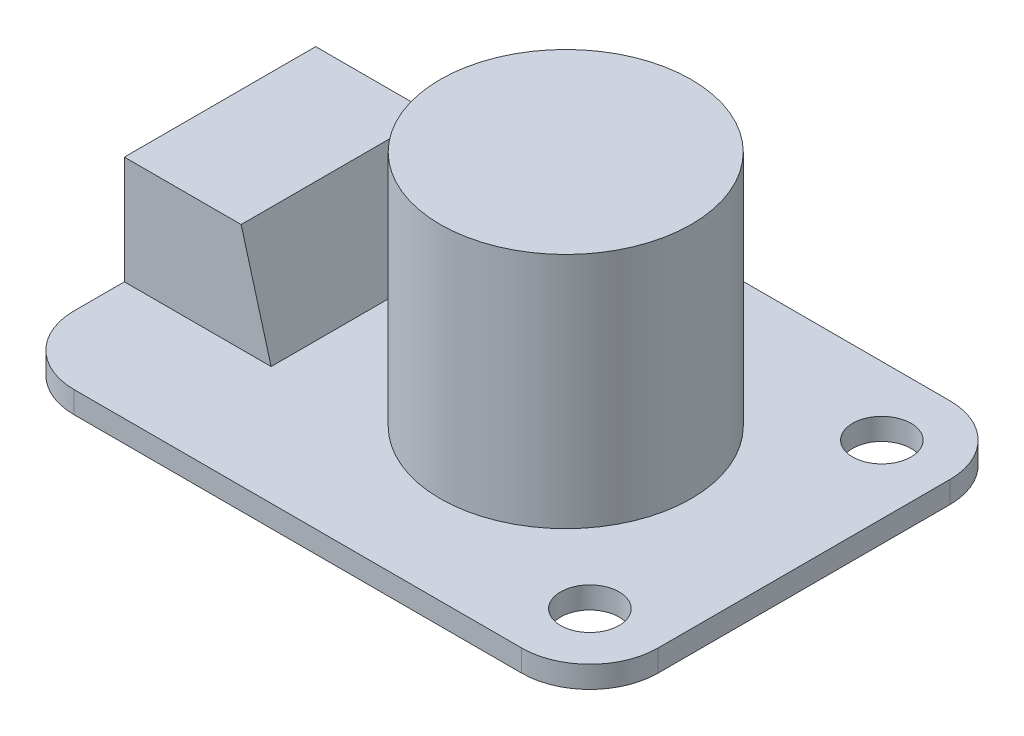
ISO-10303-21;
HEADER;
FILE_DESCRIPTION(('STEP AP214'),'2;1');
FILE_NAME('part.step','',(''),(''),'','','');
FILE_SCHEMA(('AUTOMOTIVE_DESIGN { 1 0 10303 214 1 1 1 1 }'));
ENDSEC;
DATA;
#1=APPLICATION_CONTEXT('core data for automotive mechanical design processes');
#2=APPLICATION_PROTOCOL_DEFINITION('international standard','automotive_design',2000,#1);
#3=PRODUCT_CONTEXT('',#1,'mechanical');
#4=PRODUCT('Part','Part','',(#3));
#5=PRODUCT_RELATED_PRODUCT_CATEGORY('part','',(#4));
#6=PRODUCT_DEFINITION_FORMATION('','',#4);
#7=PRODUCT_DEFINITION_CONTEXT('part definition',#1,'design');
#8=PRODUCT_DEFINITION('design','',#6,#7);
#9=PRODUCT_DEFINITION_SHAPE('','',#8);
#10=(LENGTH_UNIT() NAMED_UNIT(*) SI_UNIT(.MILLI.,.METRE.));
#11=(NAMED_UNIT(*) PLANE_ANGLE_UNIT() SI_UNIT($,.RADIAN.));
#12=(NAMED_UNIT(*) SI_UNIT($,.STERADIAN.) SOLID_ANGLE_UNIT());
#13=UNCERTAINTY_MEASURE_WITH_UNIT(LENGTH_MEASURE(1.E-05),#10,'distance_accuracy_value','');
#14=(GEOMETRIC_REPRESENTATION_CONTEXT(3) GLOBAL_UNCERTAINTY_ASSIGNED_CONTEXT((#13)) GLOBAL_UNIT_ASSIGNED_CONTEXT((#10,
#11,#12)) REPRESENTATION_CONTEXT('',''));
#15=CARTESIAN_POINT('',(0.,0.,0.));
#16=DIRECTION('',(0.,0.,1.));
#17=DIRECTION('',(1.,0.,0.));
#18=AXIS2_PLACEMENT_3D('',#15,#16,#17);
#19=CARTESIAN_POINT('',(3.5,1.12,-18.5));
#20=DIRECTION('',(0.,1.,0.));
#21=DIRECTION('',(0.,0.,1.));
#22=AXIS2_PLACEMENT_3D('',#19,#20,#21);
#23=PLANE('',#22);
#24=CARTESIAN_POINT('',(17.76,1.12,-11.));
#25=DIRECTION('',(0.,1.,0.));
#26=DIRECTION('',(0.,0.,1.));
#27=AXIS2_PLACEMENT_3D('',#24,#25,#26);
#28=CIRCLE('',#27,6.45);
#29=CARTESIAN_POINT('',(17.76,1.12,-4.55));
#30=VERTEX_POINT('',#29);
#31=EDGE_CURVE('E159',#30,#30,#28,.T.);
#32=ORIENTED_EDGE('',*,*,#31,.F.);
#33=EDGE_LOOP('',(#32));
#34=FACE_BOUND('',#33,.T.);
#35=CARTESIAN_POINT('',(26.5,1.12,-18.5));
#36=DIRECTION('',(0.,1.,0.));
#37=DIRECTION('',(0.,0.,1.));
#38=AXIS2_PLACEMENT_3D('',#35,#36,#37);
#39=CIRCLE('',#38,1.5);
#40=CARTESIAN_POINT('',(26.5,1.12,-17.));
#41=VERTEX_POINT('',#40);
#42=EDGE_CURVE('E192',#41,#41,#39,.T.);
#43=ORIENTED_EDGE('',*,*,#42,.F.);
#44=EDGE_LOOP('',(#43));
#45=FACE_BOUND('',#44,.T.);
#46=CARTESIAN_POINT('',(26.5,1.12,-3.5));
#47=DIRECTION('',(0.,1.,0.));
#48=DIRECTION('',(0.,0.,1.));
#49=AXIS2_PLACEMENT_3D('',#46,#47,#48);
#50=CIRCLE('',#49,1.5);
#51=CARTESIAN_POINT('',(26.5,1.12,-2.));
#52=VERTEX_POINT('',#51);
#53=EDGE_CURVE('E184',#52,#52,#50,.T.);
#54=ORIENTED_EDGE('',*,*,#53,.F.);
#55=EDGE_LOOP('',(#54));
#56=FACE_BOUND('',#55,.T.);
#57=DIRECTION('',(-1.,0.,0.));
#58=VECTOR('',#57,1.);
#59=CARTESIAN_POINT('',(6.,1.12,-15.915));
#60=LINE('',#59,#58);
#61=CARTESIAN_POINT('',(7.54,1.12,-15.915));
#62=VERTEX_POINT('',#61);
#63=CARTESIAN_POINT('',(0.,1.12,-15.915));
#64=VERTEX_POINT('',#63);
#65=EDGE_CURVE('E132',#62,#64,#60,.T.);
#66=ORIENTED_EDGE('',*,*,#65,.F.);
#67=DIRECTION('',(0.,0.,1.));
#68=VECTOR('',#67,1.);
#69=CARTESIAN_POINT('',(7.54,1.12,-15.915));
#70=LINE('',#69,#68);
#71=CARTESIAN_POINT('',(7.54,1.12,-6.085));
#72=VERTEX_POINT('',#71);
#73=EDGE_CURVE('E134',#62,#72,#70,.T.);
#74=ORIENTED_EDGE('',*,*,#73,.T.);
#75=DIRECTION('',(1.,0.,0.));
#76=VECTOR('',#75,1.);
#77=CARTESIAN_POINT('',(0.,1.12,-6.085));
#78=LINE('',#77,#76);
#79=CARTESIAN_POINT('',(0.,1.12,-6.085));
#80=VERTEX_POINT('',#79);
#81=EDGE_CURVE('E61',#80,#72,#78,.T.);
#82=ORIENTED_EDGE('',*,*,#81,.F.);
#83=DIRECTION('',(0.,0.,1.));
#84=VECTOR('',#83,1.);
#85=CARTESIAN_POINT('',(0.,1.12,-18.5));
#86=LINE('',#85,#84);
#87=CARTESIAN_POINT('',(0.,1.12,-3.5));
#88=VERTEX_POINT('',#87);
#89=EDGE_CURVE('E203',#80,#88,#86,.T.);
#90=ORIENTED_EDGE('',*,*,#89,.T.);
#91=CARTESIAN_POINT('',(3.5,1.12,-3.5));
#92=DIRECTION('',(0.,1.,0.));
#93=DIRECTION('',(0.,0.,-1.));
#94=AXIS2_PLACEMENT_3D('',#91,#92,#93);
#95=CIRCLE('',#94,3.5);
#96=CARTESIAN_POINT('',(3.5,1.12,0.));
#97=VERTEX_POINT('',#96);
#98=EDGE_CURVE('E207',#88,#97,#95,.T.);
#99=ORIENTED_EDGE('',*,*,#98,.T.);
#100=DIRECTION('',(1.,0.,0.));
#101=VECTOR('',#100,1.);
#102=CARTESIAN_POINT('',(3.5,1.12,0.));
#103=LINE('',#102,#101);
#104=CARTESIAN_POINT('',(26.5,1.12,0.));
#105=VERTEX_POINT('',#104);
#106=EDGE_CURVE('E210',#97,#105,#103,.T.);
#107=ORIENTED_EDGE('',*,*,#106,.T.);
#108=CARTESIAN_POINT('',(26.5,1.12,-3.5));
#109=DIRECTION('',(0.,1.,0.));
#110=DIRECTION('',(0.,0.,1.));
#111=AXIS2_PLACEMENT_3D('',#108,#109,#110);
#112=CIRCLE('',#111,3.5);
#113=CARTESIAN_POINT('',(30.,1.12,-3.5));
#114=VERTEX_POINT('',#113);
#115=EDGE_CURVE('E213',#105,#114,#112,.T.);
#116=ORIENTED_EDGE('',*,*,#115,.T.);
#117=DIRECTION('',(0.,0.,-1.));
#118=VECTOR('',#117,1.);
#119=CARTESIAN_POINT('',(30.,1.12,-3.5));
#120=LINE('',#119,#118);
#121=CARTESIAN_POINT('',(30.,1.12,-18.5));
#122=VERTEX_POINT('',#121);
#123=EDGE_CURVE('E216',#114,#122,#120,.T.);
#124=ORIENTED_EDGE('',*,*,#123,.T.);
#125=CARTESIAN_POINT('',(26.5,1.12,-18.5));
#126=DIRECTION('',(0.,1.,0.));
#127=DIRECTION('',(0.,0.,1.));
#128=AXIS2_PLACEMENT_3D('',#125,#126,#127);
#129=CIRCLE('',#128,3.5);
#130=CARTESIAN_POINT('',(26.5,1.12,-22.));
#131=VERTEX_POINT('',#130);
#132=EDGE_CURVE('E219',#122,#131,#129,.T.);
#133=ORIENTED_EDGE('',*,*,#132,.T.);
#134=DIRECTION('',(-1.,0.,0.));
#135=VECTOR('',#134,1.);
#136=CARTESIAN_POINT('',(26.5,1.12,-22.));
#137=LINE('',#136,#135);
#138=CARTESIAN_POINT('',(3.5,1.12,-22.));
#139=VERTEX_POINT('',#138);
#140=EDGE_CURVE('E222',#131,#139,#137,.T.);
#141=ORIENTED_EDGE('',*,*,#140,.T.);
#142=CARTESIAN_POINT('',(3.5,1.12,-18.5));
#143=DIRECTION('',(0.,1.,0.));
#144=DIRECTION('',(0.,0.,1.));
#145=AXIS2_PLACEMENT_3D('',#142,#143,#144);
#146=CIRCLE('',#145,3.5);
#147=CARTESIAN_POINT('',(0.,1.12,-18.5));
#148=VERTEX_POINT('',#147);
#149=EDGE_CURVE('E200',#139,#148,#146,.T.);
#150=ORIENTED_EDGE('',*,*,#149,.T.);
#151=EDGE_CURVE('E68',#148,#64,#86,.T.);
#152=ORIENTED_EDGE('',*,*,#151,.T.);
#153=EDGE_LOOP('',(#66,#74,#82,#90,#99,#107,#116,#124,#133,#141,#150,#152));
#154=FACE_BOUND('',#153,.T.);
#155=ADVANCED_FACE('F45',(#34,#45,#56,#154),#23,.T.);
#156=CARTESIAN_POINT('',(3.5,0.,-18.5));
#157=DIRECTION('',(0.,1.,0.));
#158=DIRECTION('',(0.,0.,1.));
#159=AXIS2_PLACEMENT_3D('',#156,#157,#158);
#160=PLANE('',#159);
#161=CARTESIAN_POINT('',(3.5,0.,-18.5));
#162=DIRECTION('',(0.,1.,0.));
#163=DIRECTION('',(0.,0.,1.));
#164=AXIS2_PLACEMENT_3D('',#161,#162,#163);
#165=CIRCLE('',#164,3.5);
#166=CARTESIAN_POINT('',(3.5,0.,-22.));
#167=VERTEX_POINT('',#166);
#168=CARTESIAN_POINT('',(0.,0.,-18.5));
#169=VERTEX_POINT('',#168);
#170=EDGE_CURVE('E196',#167,#169,#165,.T.);
#171=ORIENTED_EDGE('',*,*,#170,.F.);
#172=DIRECTION('',(-1.,0.,0.));
#173=VECTOR('',#172,1.);
#174=CARTESIAN_POINT('',(26.5,0.,-22.));
#175=LINE('',#174,#173);
#176=CARTESIAN_POINT('',(26.5,0.,-22.));
#177=VERTEX_POINT('',#176);
#178=EDGE_CURVE('E204',#177,#167,#175,.T.);
#179=ORIENTED_EDGE('',*,*,#178,.F.);
#180=CARTESIAN_POINT('',(26.5,0.,-18.5));
#181=DIRECTION('',(0.,1.,0.));
#182=DIRECTION('',(0.,0.,1.));
#183=AXIS2_PLACEMENT_3D('',#180,#181,#182);
#184=CIRCLE('',#183,3.5);
#185=CARTESIAN_POINT('',(30.,0.,-18.5));
#186=VERTEX_POINT('',#185);
#187=EDGE_CURVE('E244',#186,#177,#184,.T.);
#188=ORIENTED_EDGE('',*,*,#187,.F.);
#189=DIRECTION('',(0.,0.,-1.));
#190=VECTOR('',#189,1.);
#191=CARTESIAN_POINT('',(30.,0.,-3.5));
#192=LINE('',#191,#190);
#193=CARTESIAN_POINT('',(30.,0.,-3.5));
#194=VERTEX_POINT('',#193);
#195=EDGE_CURVE('E241',#194,#186,#192,.T.);
#196=ORIENTED_EDGE('',*,*,#195,.F.);
#197=CARTESIAN_POINT('',(26.5,0.,-3.5));
#198=DIRECTION('',(0.,1.,0.));
#199=DIRECTION('',(0.,0.,1.));
#200=AXIS2_PLACEMENT_3D('',#197,#198,#199);
#201=CIRCLE('',#200,3.5);
#202=CARTESIAN_POINT('',(26.5,0.,0.));
#203=VERTEX_POINT('',#202);
#204=EDGE_CURVE('E238',#203,#194,#201,.T.);
#205=ORIENTED_EDGE('',*,*,#204,.F.);
#206=DIRECTION('',(1.,0.,0.));
#207=VECTOR('',#206,1.);
#208=CARTESIAN_POINT('',(3.5,0.,0.));
#209=LINE('',#208,#207);
#210=CARTESIAN_POINT('',(3.5,0.,0.));
#211=VERTEX_POINT('',#210);
#212=EDGE_CURVE('E235',#211,#203,#209,.T.);
#213=ORIENTED_EDGE('',*,*,#212,.F.);
#214=CARTESIAN_POINT('',(3.5,0.,-3.5));
#215=DIRECTION('',(0.,1.,0.));
#216=DIRECTION('',(0.,0.,-1.));
#217=AXIS2_PLACEMENT_3D('',#214,#215,#216);
#218=CIRCLE('',#217,3.5);
#219=CARTESIAN_POINT('',(0.,0.,-3.5));
#220=VERTEX_POINT('',#219);
#221=EDGE_CURVE('E232',#220,#211,#218,.T.);
#222=ORIENTED_EDGE('',*,*,#221,.F.);
#223=DIRECTION('',(0.,0.,1.));
#224=VECTOR('',#223,1.);
#225=CARTESIAN_POINT('',(0.,0.,-18.5));
#226=LINE('',#225,#224);
#227=EDGE_CURVE('E229',#169,#220,#226,.T.);
#228=ORIENTED_EDGE('',*,*,#227,.F.);
#229=EDGE_LOOP('',(#171,#179,#188,#196,#205,#213,#222,#228));
#230=FACE_BOUND('',#229,.T.);
#231=CARTESIAN_POINT('',(26.5,0.,-18.5));
#232=DIRECTION('',(0.,1.,0.));
#233=DIRECTION('',(0.,0.,1.));
#234=AXIS2_PLACEMENT_3D('',#231,#232,#233);
#235=CIRCLE('',#234,1.5);
#236=CARTESIAN_POINT('',(26.5,0.,-17.));
#237=VERTEX_POINT('',#236);
#238=EDGE_CURVE('E188',#237,#237,#235,.T.);
#239=ORIENTED_EDGE('',*,*,#238,.T.);
#240=EDGE_LOOP('',(#239));
#241=FACE_BOUND('',#240,.T.);
#242=CARTESIAN_POINT('',(26.5,0.,-3.5));
#243=DIRECTION('',(0.,1.,0.));
#244=DIRECTION('',(0.,0.,1.));
#245=AXIS2_PLACEMENT_3D('',#242,#243,#244);
#246=CIRCLE('',#245,1.5);
#247=CARTESIAN_POINT('',(26.5,0.,-2.));
#248=VERTEX_POINT('',#247);
#249=EDGE_CURVE('E183',#248,#248,#246,.T.);
#250=ORIENTED_EDGE('',*,*,#249,.T.);
#251=EDGE_LOOP('',(#250));
#252=FACE_BOUND('',#251,.T.);
#253=ADVANCED_FACE('F283',(#230,#241,#252),#160,.F.);
#254=CARTESIAN_POINT('',(3.5,1.12,-18.5));
#255=DIRECTION('',(0.,-1.,0.));
#256=DIRECTION('',(0.,0.,-1.));
#257=AXIS2_PLACEMENT_3D('',#254,#255,#256);
#258=CYLINDRICAL_SURFACE('',#257,3.5);
#259=ORIENTED_EDGE('',*,*,#170,.T.);
#260=DIRECTION('',(0.,-1.,0.));
#261=VECTOR('',#260,1.);
#262=CARTESIAN_POINT('',(0.,1.12,-18.5));
#263=LINE('',#262,#261);
#264=EDGE_CURVE('E11',#148,#169,#263,.T.);
#265=ORIENTED_EDGE('',*,*,#264,.F.);
#266=ORIENTED_EDGE('',*,*,#149,.F.);
#267=DIRECTION('',(0.,-1.,0.));
#268=VECTOR('',#267,1.);
#269=CARTESIAN_POINT('',(3.5,1.12,-22.));
#270=LINE('',#269,#268);
#271=EDGE_CURVE('E225',#139,#167,#270,.T.);
#272=ORIENTED_EDGE('',*,*,#271,.T.);
#273=EDGE_LOOP('',(#259,#265,#266,#272));
#274=FACE_BOUND('',#273,.T.);
#275=ADVANCED_FACE('F47',(#274),#258,.T.);
#276=CARTESIAN_POINT('',(0.,1.12,-18.5));
#277=DIRECTION('',(1.,0.,0.));
#278=DIRECTION('',(0.,0.,-1.));
#279=AXIS2_PLACEMENT_3D('',#276,#277,#278);
#280=PLANE('',#279);
#281=ORIENTED_EDGE('',*,*,#89,.F.);
#282=DIRECTION('',(0.,-1.,0.));
#283=VECTOR('',#282,1.);
#284=CARTESIAN_POINT('',(0.,6.67,-6.085));
#285=LINE('',#284,#283);
#286=CARTESIAN_POINT('',(0.,6.67,-6.085));
#287=VERTEX_POINT('',#286);
#288=EDGE_CURVE('E173',#287,#80,#285,.T.);
#289=ORIENTED_EDGE('',*,*,#288,.F.);
#290=DIRECTION('',(0.,0.,1.));
#291=VECTOR('',#290,1.);
#292=CARTESIAN_POINT('',(0.,6.67,-15.915));
#293=LINE('',#292,#291);
#294=CARTESIAN_POINT('',(0.,6.67,-15.915));
#295=VERTEX_POINT('',#294);
#296=EDGE_CURVE('E164',#295,#287,#293,.T.);
#297=ORIENTED_EDGE('',*,*,#296,.F.);
#298=DIRECTION('',(0.,-1.,0.));
#299=VECTOR('',#298,1.);
#300=CARTESIAN_POINT('',(0.,6.67,-15.915));
#301=LINE('',#300,#299);
#302=EDGE_CURVE('E180',#295,#64,#301,.T.);
#303=ORIENTED_EDGE('',*,*,#302,.T.);
#304=ORIENTED_EDGE('',*,*,#151,.F.);
#305=ORIENTED_EDGE('',*,*,#264,.T.);
#306=ORIENTED_EDGE('',*,*,#227,.T.);
#307=DIRECTION('',(0.,-1.,0.));
#308=VECTOR('',#307,1.);
#309=CARTESIAN_POINT('',(0.,1.12,-3.5));
#310=LINE('',#309,#308);
#311=EDGE_CURVE('E54',#88,#220,#310,.T.);
#312=ORIENTED_EDGE('',*,*,#311,.F.);
#313=EDGE_LOOP('',(#281,#289,#297,#303,#304,#305,#306,#312));
#314=FACE_BOUND('',#313,.T.);
#315=ADVANCED_FACE('F299',(#314),#280,.F.);
#316=CARTESIAN_POINT('',(3.5,1.12,-3.5));
#317=DIRECTION('',(0.,-1.,0.));
#318=DIRECTION('',(0.,0.,-1.));
#319=AXIS2_PLACEMENT_3D('',#316,#317,#318);
#320=CYLINDRICAL_SURFACE('',#319,3.5);
#321=ORIENTED_EDGE('',*,*,#221,.T.);
#322=DIRECTION('',(0.,-1.,0.));
#323=VECTOR('',#322,1.);
#324=CARTESIAN_POINT('',(3.5,1.12,0.));
#325=LINE('',#324,#323);
#326=EDGE_CURVE('E268',#97,#211,#325,.T.);
#327=ORIENTED_EDGE('',*,*,#326,.F.);
#328=ORIENTED_EDGE('',*,*,#98,.F.);
#329=ORIENTED_EDGE('',*,*,#311,.T.);
#330=EDGE_LOOP('',(#321,#327,#328,#329));
#331=FACE_BOUND('',#330,.T.);
#332=ADVANCED_FACE('F277',(#331),#320,.T.);
#333=CARTESIAN_POINT('',(3.5,1.12,0.));
#334=DIRECTION('',(0.,0.,-1.));
#335=DIRECTION('',(-1.,0.,0.));
#336=AXIS2_PLACEMENT_3D('',#333,#334,#335);
#337=PLANE('',#336);
#338=ORIENTED_EDGE('',*,*,#212,.T.);
#339=DIRECTION('',(0.,-1.,0.));
#340=VECTOR('',#339,1.);
#341=CARTESIAN_POINT('',(26.5,1.12,0.));
#342=LINE('',#341,#340);
#343=EDGE_CURVE('E264',#105,#203,#342,.T.);
#344=ORIENTED_EDGE('',*,*,#343,.F.);
#345=ORIENTED_EDGE('',*,*,#106,.F.);
#346=ORIENTED_EDGE('',*,*,#326,.T.);
#347=EDGE_LOOP('',(#338,#344,#345,#346));
#348=FACE_BOUND('',#347,.T.);
#349=ADVANCED_FACE('F289',(#348),#337,.F.);
#350=CARTESIAN_POINT('',(26.5,1.12,-3.5));
#351=DIRECTION('',(0.,-1.,0.));
#352=DIRECTION('',(0.,0.,-1.));
#353=AXIS2_PLACEMENT_3D('',#350,#351,#352);
#354=CYLINDRICAL_SURFACE('',#353,3.5);
#355=ORIENTED_EDGE('',*,*,#204,.T.);
#356=DIRECTION('',(0.,-1.,0.));
#357=VECTOR('',#356,1.);
#358=CARTESIAN_POINT('',(30.,1.12,-3.5));
#359=LINE('',#358,#357);
#360=EDGE_CURVE('E260',#114,#194,#359,.T.);
#361=ORIENTED_EDGE('',*,*,#360,.F.);
#362=ORIENTED_EDGE('',*,*,#115,.F.);
#363=ORIENTED_EDGE('',*,*,#343,.T.);
#364=EDGE_LOOP('',(#355,#361,#362,#363));
#365=FACE_BOUND('',#364,.T.);
#366=ADVANCED_FACE('F293',(#365),#354,.T.);
#367=CARTESIAN_POINT('',(30.,1.12,-3.5));
#368=DIRECTION('',(-1.,0.,0.));
#369=DIRECTION('',(0.,0.,1.));
#370=AXIS2_PLACEMENT_3D('',#367,#368,#369);
#371=PLANE('',#370);
#372=ORIENTED_EDGE('',*,*,#195,.T.);
#373=DIRECTION('',(0.,-1.,0.));
#374=VECTOR('',#373,1.);
#375=CARTESIAN_POINT('',(30.,1.12,-18.5));
#376=LINE('',#375,#374);
#377=EDGE_CURVE('E256',#122,#186,#376,.T.);
#378=ORIENTED_EDGE('',*,*,#377,.F.);
#379=ORIENTED_EDGE('',*,*,#123,.F.);
#380=ORIENTED_EDGE('',*,*,#360,.T.);
#381=EDGE_LOOP('',(#372,#378,#379,#380));
#382=FACE_BOUND('',#381,.T.);
#383=ADVANCED_FACE('F319',(#382),#371,.F.);
#384=CARTESIAN_POINT('',(26.5,1.12,-18.5));
#385=DIRECTION('',(0.,-1.,0.));
#386=DIRECTION('',(0.,0.,-1.));
#387=AXIS2_PLACEMENT_3D('',#384,#385,#386);
#388=CYLINDRICAL_SURFACE('',#387,3.5);
#389=ORIENTED_EDGE('',*,*,#187,.T.);
#390=DIRECTION('',(0.,-1.,0.));
#391=VECTOR('',#390,1.);
#392=CARTESIAN_POINT('',(26.5,1.12,-22.));
#393=LINE('',#392,#391);
#394=EDGE_CURVE('E252',#131,#177,#393,.T.);
#395=ORIENTED_EDGE('',*,*,#394,.F.);
#396=ORIENTED_EDGE('',*,*,#132,.F.);
#397=ORIENTED_EDGE('',*,*,#377,.T.);
#398=EDGE_LOOP('',(#389,#395,#396,#397));
#399=FACE_BOUND('',#398,.T.);
#400=ADVANCED_FACE('F317',(#399),#388,.T.);
#401=CARTESIAN_POINT('',(26.5,1.12,-22.));
#402=DIRECTION('',(0.,0.,1.));
#403=DIRECTION('',(1.,0.,0.));
#404=AXIS2_PLACEMENT_3D('',#401,#402,#403);
#405=PLANE('',#404);
#406=ORIENTED_EDGE('',*,*,#178,.T.);
#407=ORIENTED_EDGE('',*,*,#271,.F.);
#408=ORIENTED_EDGE('',*,*,#140,.F.);
#409=ORIENTED_EDGE('',*,*,#394,.T.);
#410=EDGE_LOOP('',(#406,#407,#408,#409));
#411=FACE_BOUND('',#410,.T.);
#412=ADVANCED_FACE('F313',(#411),#405,.F.);
#413=CARTESIAN_POINT('',(26.5,1.12,-18.5));
#414=DIRECTION('',(0.,-1.,0.));
#415=DIRECTION('',(0.,0.,-1.));
#416=AXIS2_PLACEMENT_3D('',#413,#414,#415);
#417=CYLINDRICAL_SURFACE('',#416,1.5);
#418=ORIENTED_EDGE('',*,*,#42,.T.);
#419=EDGE_LOOP('',(#418));
#420=FACE_BOUND('',#419,.T.);
#421=ORIENTED_EDGE('',*,*,#238,.F.);
#422=EDGE_LOOP('',(#421));
#423=FACE_BOUND('',#422,.T.);
#424=ADVANCED_FACE('F338',(#420,#423),#417,.F.);
#425=CARTESIAN_POINT('',(26.5,1.12,-3.5));
#426=DIRECTION('',(0.,-1.,0.));
#427=DIRECTION('',(0.,0.,-1.));
#428=AXIS2_PLACEMENT_3D('',#425,#426,#427);
#429=CYLINDRICAL_SURFACE('',#428,1.5);
#430=ORIENTED_EDGE('',*,*,#53,.T.);
#431=EDGE_LOOP('',(#430));
#432=FACE_BOUND('',#431,.T.);
#433=ORIENTED_EDGE('',*,*,#249,.F.);
#434=EDGE_LOOP('',(#433));
#435=FACE_BOUND('',#434,.T.);
#436=ADVANCED_FACE('F345',(#432,#435),#429,.F.);
#437=CARTESIAN_POINT('',(6.,6.67,-15.915));
#438=DIRECTION('',(0.,0.,1.));
#439=DIRECTION('',(1.,0.,0.));
#440=AXIS2_PLACEMENT_3D('',#437,#438,#439);
#441=PLANE('',#440);
#442=ORIENTED_EDGE('',*,*,#65,.T.);
#443=ORIENTED_EDGE('',*,*,#302,.F.);
#444=DIRECTION('',(-1.,0.,0.));
#445=VECTOR('',#444,1.);
#446=CARTESIAN_POINT('',(6.,6.67,-15.915));
#447=LINE('',#446,#445);
#448=CARTESIAN_POINT('',(6.,6.67,-15.915));
#449=VERTEX_POINT('',#448);
#450=EDGE_CURVE('E152',#449,#295,#447,.T.);
#451=ORIENTED_EDGE('',*,*,#450,.F.);
#452=DIRECTION('',(-0.267375214571469,0.9635924940725,0.));
#453=VECTOR('',#452,1.);
#454=CARTESIAN_POINT('',(7.54,1.12,-15.915));
#455=LINE('',#454,#453);
#456=EDGE_CURVE('E143',#62,#449,#455,.T.);
#457=ORIENTED_EDGE('',*,*,#456,.F.);
#458=EDGE_LOOP('',(#442,#443,#451,#457));
#459=FACE_BOUND('',#458,.T.);
#460=ADVANCED_FACE('F150',(#459),#441,.F.);
#461=CARTESIAN_POINT('',(0.,6.67,-6.085));
#462=DIRECTION('',(0.,0.,-1.));
#463=DIRECTION('',(-1.,0.,0.));
#464=AXIS2_PLACEMENT_3D('',#461,#462,#463);
#465=PLANE('',#464);
#466=ORIENTED_EDGE('',*,*,#81,.T.);
#467=DIRECTION('',(-0.267375214571469,0.9635924940725,0.));
#468=VECTOR('',#467,1.);
#469=CARTESIAN_POINT('',(7.54,1.12,-6.085));
#470=LINE('',#469,#468);
#471=CARTESIAN_POINT('',(6.,6.67,-6.085));
#472=VERTEX_POINT('',#471);
#473=EDGE_CURVE('E146',#72,#472,#470,.T.);
#474=ORIENTED_EDGE('',*,*,#473,.T.);
#475=DIRECTION('',(1.,0.,0.));
#476=VECTOR('',#475,1.);
#477=CARTESIAN_POINT('',(0.,6.67,-6.085));
#478=LINE('',#477,#476);
#479=EDGE_CURVE('E167',#287,#472,#478,.T.);
#480=ORIENTED_EDGE('',*,*,#479,.F.);
#481=ORIENTED_EDGE('',*,*,#288,.T.);
#482=EDGE_LOOP('',(#466,#474,#480,#481));
#483=FACE_BOUND('',#482,.T.);
#484=ADVANCED_FACE('F302',(#483),#465,.F.);
#485=CARTESIAN_POINT('',(0.,6.67,0.));
#486=DIRECTION('',(0.,1.,0.));
#487=DIRECTION('',(0.,0.,1.));
#488=AXIS2_PLACEMENT_3D('',#485,#486,#487);
#489=PLANE('',#488);
#490=ORIENTED_EDGE('',*,*,#450,.T.);
#491=ORIENTED_EDGE('',*,*,#296,.T.);
#492=ORIENTED_EDGE('',*,*,#479,.T.);
#493=DIRECTION('',(0.,0.,-1.));
#494=VECTOR('',#493,1.);
#495=CARTESIAN_POINT('',(6.,6.67,-6.085));
#496=LINE('',#495,#494);
#497=EDGE_CURVE('E171',#472,#449,#496,.T.);
#498=ORIENTED_EDGE('',*,*,#497,.T.);
#499=EDGE_LOOP('',(#490,#491,#492,#498));
#500=FACE_BOUND('',#499,.T.);
#501=ADVANCED_FACE('F304',(#500),#489,.T.);
#502=CARTESIAN_POINT('',(7.54,1.12,-15.915));
#503=DIRECTION('',(0.9635924940725,0.267375214571469,0.));
#504=DIRECTION('',(-0.267375214571469,0.9635924940725,0.));
#505=AXIS2_PLACEMENT_3D('',#502,#503,#504);
#506=PLANE('',#505);
#507=ORIENTED_EDGE('',*,*,#473,.F.);
#508=ORIENTED_EDGE('',*,*,#73,.F.);
#509=ORIENTED_EDGE('',*,*,#456,.T.);
#510=ORIENTED_EDGE('',*,*,#497,.F.);
#511=EDGE_LOOP('',(#507,#508,#509,#510));
#512=FACE_BOUND('',#511,.T.);
#513=ADVANCED_FACE('F142',(#512),#506,.T.);
#514=CARTESIAN_POINT('',(17.76,13.32,-11.));
#515=DIRECTION('',(0.,-1.,0.));
#516=DIRECTION('',(0.,0.,-1.));
#517=AXIS2_PLACEMENT_3D('',#514,#515,#516);
#518=CYLINDRICAL_SURFACE('',#517,6.45);
#519=CARTESIAN_POINT('',(17.76,13.32,-11.));
#520=DIRECTION('',(0.,1.,0.));
#521=DIRECTION('',(0.,0.,1.));
#522=AXIS2_PLACEMENT_3D('',#519,#520,#521);
#523=CIRCLE('',#522,6.45);
#524=CARTESIAN_POINT('',(17.76,13.32,-4.55));
#525=VERTEX_POINT('',#524);
#526=EDGE_CURVE('E156',#525,#525,#523,.T.);
#527=ORIENTED_EDGE('',*,*,#526,.F.);
#528=EDGE_LOOP('',(#527));
#529=FACE_BOUND('',#528,.T.);
#530=ORIENTED_EDGE('',*,*,#31,.T.);
#531=EDGE_LOOP('',(#530));
#532=FACE_BOUND('',#531,.T.);
#533=ADVANCED_FACE('F370',(#529,#532),#518,.T.);
#534=CARTESIAN_POINT('',(17.76,13.32,-11.));
#535=DIRECTION('',(0.,1.,0.));
#536=DIRECTION('',(0.,0.,1.));
#537=AXIS2_PLACEMENT_3D('',#534,#535,#536);
#538=PLANE('',#537);
#539=ORIENTED_EDGE('',*,*,#526,.T.);
#540=EDGE_LOOP('',(#539));
#541=FACE_BOUND('',#540,.T.);
#542=ADVANCED_FACE('F373',(#541),#538,.T.);
#543=CLOSED_SHELL('',(#155,#253,#275,#315,#332,#349,#366,#383,#400,#412,#424,#436,#460,#484,
#501,#513,#533,#542));
#544=MANIFOLD_SOLID_BREP('B2',#543);
#545=ADVANCED_BREP_SHAPE_REPRESENTATION('',(#18,#544),#14);
#546=SHAPE_DEFINITION_REPRESENTATION(#9,#545);
ENDSEC;
END-ISO-10303-21;
